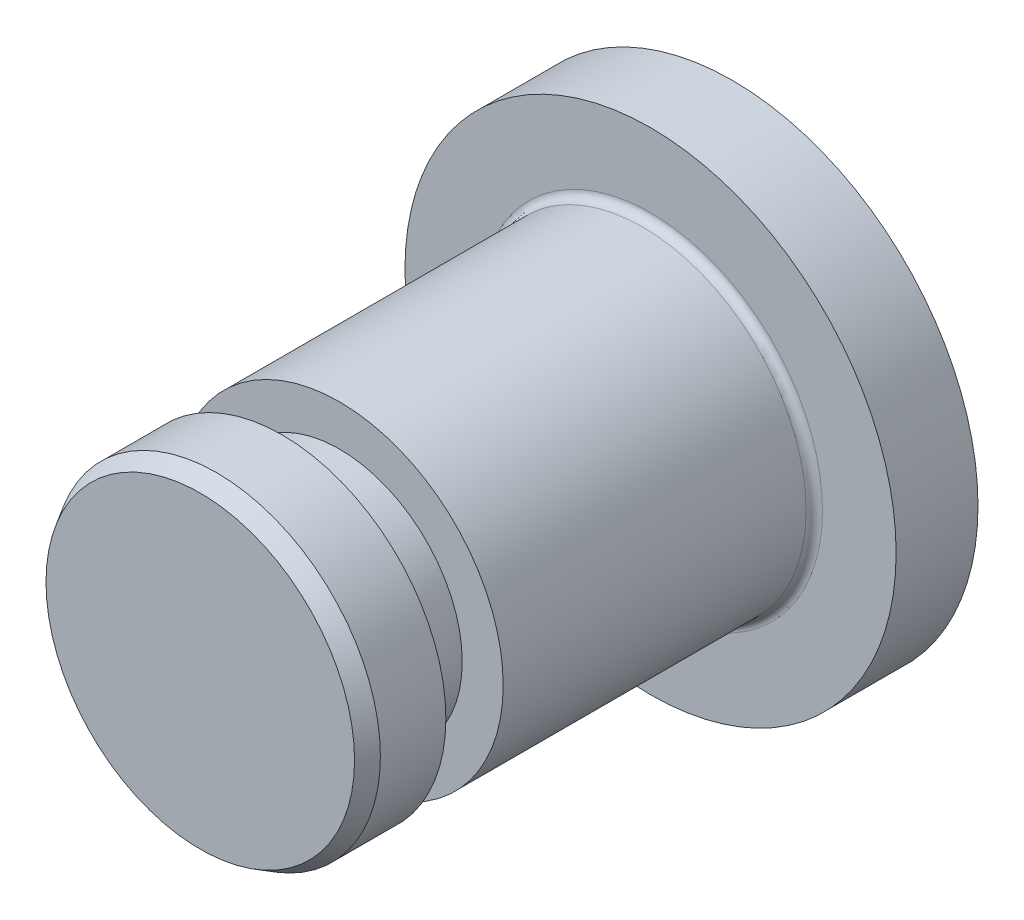
ISO-10303-21;
HEADER;
FILE_DESCRIPTION(('STEP AP214'),'2;1');
FILE_NAME('part.step','',(''),(''),'','','');
FILE_SCHEMA(('AUTOMOTIVE_DESIGN { 1 0 10303 214 1 1 1 1 }'));
ENDSEC;
DATA;
#1=APPLICATION_CONTEXT('core data for automotive mechanical design processes');
#2=APPLICATION_PROTOCOL_DEFINITION('international standard','automotive_design',2000,#1);
#3=PRODUCT_CONTEXT('',#1,'mechanical');
#4=PRODUCT('Part','Part','',(#3));
#5=PRODUCT_RELATED_PRODUCT_CATEGORY('part','',(#4));
#6=PRODUCT_DEFINITION_FORMATION('','',#4);
#7=PRODUCT_DEFINITION_CONTEXT('part definition',#1,'design');
#8=PRODUCT_DEFINITION('design','',#6,#7);
#9=PRODUCT_DEFINITION_SHAPE('','',#8);
#10=(LENGTH_UNIT() NAMED_UNIT(*) SI_UNIT(.MILLI.,.METRE.));
#11=(NAMED_UNIT(*) PLANE_ANGLE_UNIT() SI_UNIT($,.RADIAN.));
#12=(NAMED_UNIT(*) SI_UNIT($,.STERADIAN.) SOLID_ANGLE_UNIT());
#13=UNCERTAINTY_MEASURE_WITH_UNIT(LENGTH_MEASURE(1.E-05),#10,'distance_accuracy_value','');
#14=(GEOMETRIC_REPRESENTATION_CONTEXT(3) GLOBAL_UNCERTAINTY_ASSIGNED_CONTEXT((#13)) GLOBAL_UNIT_ASSIGNED_CONTEXT((#10,
#11,#12)) REPRESENTATION_CONTEXT('',''));
#15=CARTESIAN_POINT('',(0.,0.,0.));
#16=DIRECTION('',(0.,0.,1.));
#17=DIRECTION('',(1.,0.,0.));
#18=AXIS2_PLACEMENT_3D('',#15,#16,#17);
#19=CARTESIAN_POINT('',(0.,0.,48.));
#20=DIRECTION('',(0.,0.,1.));
#21=DIRECTION('',(1.,0.,0.));
#22=AXIS2_PLACEMENT_3D('',#19,#20,#21);
#23=PLANE('',#22);
#24=CARTESIAN_POINT('',(0.,0.,48.));
#25=DIRECTION('',(0.,0.,1.));
#26=DIRECTION('',(1.,0.,0.));
#27=AXIS2_PLACEMENT_3D('',#24,#25,#26);
#28=CIRCLE('',#27,20.);
#29=CARTESIAN_POINT('',(20.,0.,48.));
#30=VERTEX_POINT('',#29);
#31=EDGE_CURVE('E56',#30,#30,#28,.T.);
#32=ORIENTED_EDGE('',*,*,#31,.T.);
#33=EDGE_LOOP('',(#32));
#34=FACE_BOUND('',#33,.T.);
#35=CARTESIAN_POINT('',(0.,0.,48.));
#36=DIRECTION('',(0.,0.,1.));
#37=DIRECTION('',(1.,0.,0.));
#38=AXIS2_PLACEMENT_3D('',#35,#36,#37);
#39=CIRCLE('',#38,15.);
#40=CARTESIAN_POINT('',(15.,0.,48.));
#41=VERTEX_POINT('',#40);
#42=EDGE_CURVE('E62',#41,#41,#39,.T.);
#43=ORIENTED_EDGE('',*,*,#42,.F.);
#44=EDGE_LOOP('',(#43));
#45=FACE_BOUND('',#44,.T.);
#46=ADVANCED_FACE('F32',(#34,#45),#23,.T.);
#47=CARTESIAN_POINT('',(0.,0.,10.));
#48=DIRECTION('',(0.,0.,1.));
#49=DIRECTION('',(1.,0.,0.));
#50=AXIS2_PLACEMENT_3D('',#47,#48,#49);
#51=PLANE('',#50);
#52=CARTESIAN_POINT('',(0.,0.,10.));
#53=DIRECTION('',(0.,0.,1.));
#54=DIRECTION('',(1.,0.,0.));
#55=AXIS2_PLACEMENT_3D('',#52,#53,#54);
#56=CIRCLE('',#55,21.);
#57=CARTESIAN_POINT('',(21.,0.,10.));
#58=VERTEX_POINT('',#57);
#59=EDGE_CURVE('E10',#58,#58,#56,.F.);
#60=ORIENTED_EDGE('',*,*,#59,.T.);
#61=EDGE_LOOP('',(#60));
#62=FACE_BOUND('',#61,.T.);
#63=CARTESIAN_POINT('',(0.,0.,10.));
#64=DIRECTION('',(0.,0.,1.));
#65=DIRECTION('',(1.,0.,0.));
#66=AXIS2_PLACEMENT_3D('',#63,#64,#65);
#67=CIRCLE('',#66,30.);
#68=CARTESIAN_POINT('',(30.,0.,10.));
#69=VERTEX_POINT('',#68);
#70=EDGE_CURVE('E52',#69,#69,#67,.T.);
#71=ORIENTED_EDGE('',*,*,#70,.T.);
#72=EDGE_LOOP('',(#71));
#73=FACE_BOUND('',#72,.T.);
#74=ADVANCED_FACE('F87',(#62,#73),#51,.T.);
#75=CARTESIAN_POINT('',(0.,0.,10.));
#76=DIRECTION('',(0.,0.,-1.));
#77=DIRECTION('',(-1.,0.,0.));
#78=AXIS2_PLACEMENT_3D('',#75,#76,#77);
#79=CYLINDRICAL_SURFACE('',#78,30.);
#80=ORIENTED_EDGE('',*,*,#70,.F.);
#81=EDGE_LOOP('',(#80));
#82=FACE_BOUND('',#81,.T.);
#83=CARTESIAN_POINT('',(0.,0.,0.));
#84=DIRECTION('',(0.,0.,1.));
#85=DIRECTION('',(1.,0.,0.));
#86=AXIS2_PLACEMENT_3D('',#83,#84,#85);
#87=CIRCLE('',#86,30.);
#88=CARTESIAN_POINT('',(30.,0.,0.));
#89=VERTEX_POINT('',#88);
#90=EDGE_CURVE('E53',#89,#89,#87,.T.);
#91=ORIENTED_EDGE('',*,*,#90,.T.);
#92=EDGE_LOOP('',(#91));
#93=FACE_BOUND('',#92,.T.);
#94=ADVANCED_FACE('F93',(#82,#93),#79,.T.);
#95=CARTESIAN_POINT('',(0.,0.,0.));
#96=DIRECTION('',(0.,0.,1.));
#97=DIRECTION('',(1.,0.,0.));
#98=AXIS2_PLACEMENT_3D('',#95,#96,#97);
#99=PLANE('',#98);
#100=ORIENTED_EDGE('',*,*,#90,.F.);
#101=EDGE_LOOP('',(#100));
#102=FACE_BOUND('',#101,.T.);
#103=ADVANCED_FACE('F98',(#102),#99,.F.);
#104=CARTESIAN_POINT('',(0.,0.,48.));
#105=DIRECTION('',(0.,0.,-1.));
#106=DIRECTION('',(-1.,0.,0.));
#107=AXIS2_PLACEMENT_3D('',#104,#105,#106);
#108=CYLINDRICAL_SURFACE('',#107,20.);
#109=CARTESIAN_POINT('',(0.,0.,11.));
#110=DIRECTION('',(0.,0.,1.));
#111=DIRECTION('',(1.,0.,0.));
#112=AXIS2_PLACEMENT_3D('',#109,#110,#111);
#113=CIRCLE('',#112,20.);
#114=CARTESIAN_POINT('',(20.,0.,11.));
#115=VERTEX_POINT('',#114);
#116=EDGE_CURVE('E39',#115,#115,#113,.T.);
#117=ORIENTED_EDGE('',*,*,#116,.T.);
#118=EDGE_LOOP('',(#117));
#119=FACE_BOUND('',#118,.T.);
#120=ORIENTED_EDGE('',*,*,#31,.F.);
#121=EDGE_LOOP('',(#120));
#122=FACE_BOUND('',#121,.T.);
#123=ADVANCED_FACE('F82',(#119,#122),#108,.T.);
#124=CARTESIAN_POINT('',(0.,0.,55.));
#125=DIRECTION('',(0.,0.,-1.));
#126=DIRECTION('',(-1.,0.,0.));
#127=AXIS2_PLACEMENT_3D('',#124,#125,#126);
#128=CYLINDRICAL_SURFACE('',#127,15.);
#129=CARTESIAN_POINT('',(0.,0.,55.));
#130=DIRECTION('',(0.,0.,1.));
#131=DIRECTION('',(1.,0.,0.));
#132=AXIS2_PLACEMENT_3D('',#129,#130,#131);
#133=CIRCLE('',#132,15.);
#134=CARTESIAN_POINT('',(15.,0.,55.));
#135=VERTEX_POINT('',#134);
#136=EDGE_CURVE('E61',#135,#135,#133,.T.);
#137=ORIENTED_EDGE('',*,*,#136,.F.);
#138=EDGE_LOOP('',(#137));
#139=FACE_BOUND('',#138,.T.);
#140=ORIENTED_EDGE('',*,*,#42,.T.);
#141=EDGE_LOOP('',(#140));
#142=FACE_BOUND('',#141,.T.);
#143=ADVANCED_FACE('F76',(#139,#142),#128,.T.);
#144=CARTESIAN_POINT('',(0.,0.,55.));
#145=DIRECTION('',(0.,0.,1.));
#146=DIRECTION('',(1.,0.,0.));
#147=AXIS2_PLACEMENT_3D('',#144,#145,#146);
#148=PLANE('',#147);
#149=CARTESIAN_POINT('',(0.,0.,55.));
#150=DIRECTION('',(0.,0.,1.));
#151=DIRECTION('',(1.,0.,0.));
#152=AXIS2_PLACEMENT_3D('',#149,#150,#151);
#153=CIRCLE('',#152,20.);
#154=CARTESIAN_POINT('',(20.,0.,55.));
#155=VERTEX_POINT('',#154);
#156=EDGE_CURVE('E65',#155,#155,#153,.T.);
#157=ORIENTED_EDGE('',*,*,#156,.F.);
#158=EDGE_LOOP('',(#157));
#159=FACE_BOUND('',#158,.T.);
#160=ORIENTED_EDGE('',*,*,#136,.T.);
#161=EDGE_LOOP('',(#160));
#162=FACE_BOUND('',#161,.T.);
#163=ADVANCED_FACE('F73',(#159,#162),#148,.F.);
#164=CARTESIAN_POINT('',(0.,0.,65.));
#165=DIRECTION('',(0.,0.,-1.));
#166=DIRECTION('',(-1.,0.,0.));
#167=AXIS2_PLACEMENT_3D('',#164,#165,#166);
#168=CYLINDRICAL_SURFACE('',#167,20.);
#169=CARTESIAN_POINT('',(0.,0.,63.));
#170=DIRECTION('',(0.,0.,1.));
#171=DIRECTION('',(1.,0.,0.));
#172=AXIS2_PLACEMENT_3D('',#169,#170,#171);
#173=CIRCLE('',#172,20.);
#174=CARTESIAN_POINT('',(20.,0.,63.));
#175=VERTEX_POINT('',#174);
#176=EDGE_CURVE('E43',#175,#175,#173,.F.);
#177=ORIENTED_EDGE('',*,*,#176,.T.);
#178=EDGE_LOOP('',(#177));
#179=FACE_BOUND('',#178,.T.);
#180=ORIENTED_EDGE('',*,*,#156,.T.);
#181=EDGE_LOOP('',(#180));
#182=FACE_BOUND('',#181,.T.);
#183=ADVANCED_FACE('F71',(#179,#182),#168,.T.);
#184=CARTESIAN_POINT('',(0.,0.,65.));
#185=DIRECTION('',(0.,0.,1.));
#186=DIRECTION('',(1.,0.,0.));
#187=AXIS2_PLACEMENT_3D('',#184,#185,#186);
#188=PLANE('',#187);
#189=CARTESIAN_POINT('',(0.,0.,65.));
#190=DIRECTION('',(0.,0.,1.));
#191=DIRECTION('',(1.,0.,0.));
#192=AXIS2_PLACEMENT_3D('',#189,#190,#191);
#193=CIRCLE('',#192,18.8452994616207);
#194=CARTESIAN_POINT('',(18.8452994616207,0.,65.));
#195=VERTEX_POINT('',#194);
#196=EDGE_CURVE('E47',#195,#195,#193,.T.);
#197=ORIENTED_EDGE('',*,*,#196,.T.);
#198=EDGE_LOOP('',(#197));
#199=FACE_BOUND('',#198,.T.);
#200=ADVANCED_FACE('F107',(#199),#188,.T.);
#201=CARTESIAN_POINT('',(0.,0.,65.));
#202=DIRECTION('',(0.,0.,-1.));
#203=DIRECTION('',(-1.,0.,0.));
#204=AXIS2_PLACEMENT_3D('',#201,#202,#203);
#205=CONICAL_SURFACE('',#204,18.8452994616207,0.523598775598299);
#206=ORIENTED_EDGE('',*,*,#176,.F.);
#207=EDGE_LOOP('',(#206));
#208=FACE_BOUND('',#207,.T.);
#209=ORIENTED_EDGE('',*,*,#196,.F.);
#210=EDGE_LOOP('',(#209));
#211=FACE_BOUND('',#210,.T.);
#212=ADVANCED_FACE('F105',(#208,#211),#205,.T.);
#213=CARTESIAN_POINT('',(0.,0.,11.));
#214=DIRECTION('',(0.,0.,1.));
#215=DIRECTION('',(1.,0.,0.));
#216=AXIS2_PLACEMENT_3D('',#213,#214,#215);
#217=TOROIDAL_SURFACE('',#216,21.,1.);
#218=ORIENTED_EDGE('',*,*,#59,.F.);
#219=EDGE_LOOP('',(#218));
#220=FACE_BOUND('',#219,.T.);
#221=ORIENTED_EDGE('',*,*,#116,.F.);
#222=EDGE_LOOP('',(#221));
#223=FACE_BOUND('',#222,.T.);
#224=ADVANCED_FACE('F34',(#220,#223),#217,.F.);
#225=CLOSED_SHELL('',(#46,#74,#94,#103,#123,#143,#163,#183,#200,#212,#224));
#226=MANIFOLD_SOLID_BREP('B2',#225);
#227=ADVANCED_BREP_SHAPE_REPRESENTATION('',(#18,#226),#14);
#228=SHAPE_DEFINITION_REPRESENTATION(#9,#227);
ENDSEC;
END-ISO-10303-21;
